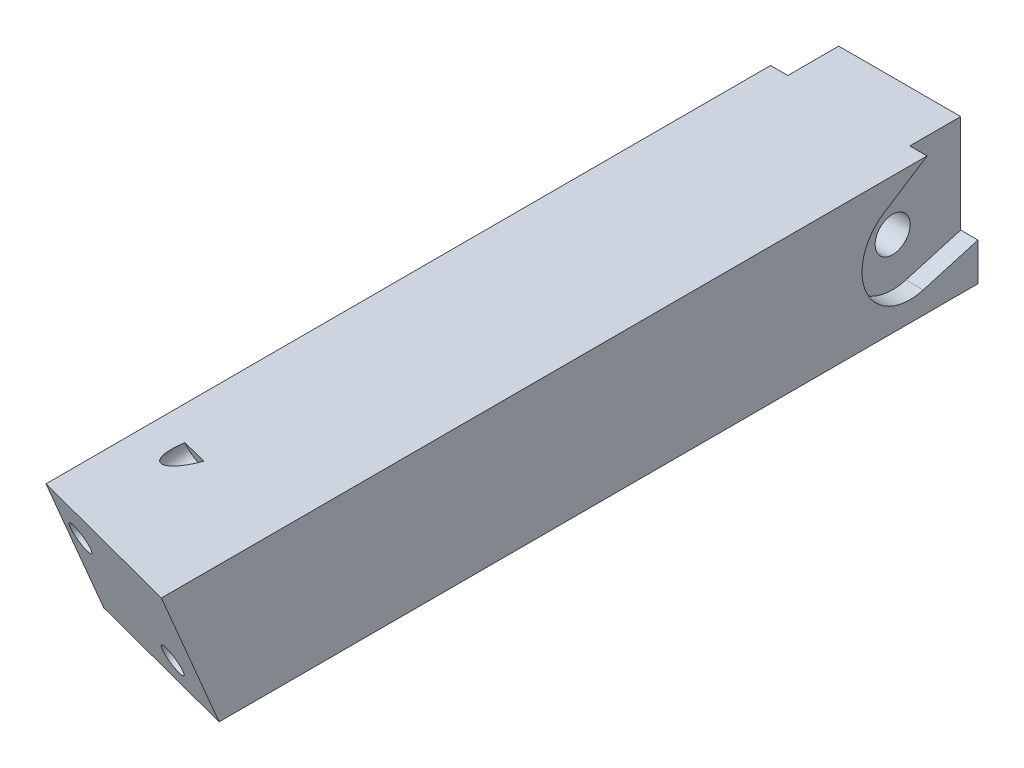
ISO-10303-21;
HEADER;
FILE_DESCRIPTION(('STEP AP214'),'2;1');
FILE_NAME('part.step','',(''),(''),'','','');
FILE_SCHEMA(('AUTOMOTIVE_DESIGN { 1 0 10303 214 1 1 1 1 }'));
ENDSEC;
DATA;
#1=APPLICATION_CONTEXT('core data for automotive mechanical design processes');
#2=APPLICATION_PROTOCOL_DEFINITION('international standard','automotive_design',2000,#1);
#3=PRODUCT_CONTEXT('',#1,'mechanical');
#4=PRODUCT('Part','Part','',(#3));
#5=PRODUCT_RELATED_PRODUCT_CATEGORY('part','',(#4));
#6=PRODUCT_DEFINITION_FORMATION('','',#4);
#7=PRODUCT_DEFINITION_CONTEXT('part definition',#1,'design');
#8=PRODUCT_DEFINITION('design','',#6,#7);
#9=PRODUCT_DEFINITION_SHAPE('','',#8);
#10=(LENGTH_UNIT() NAMED_UNIT(*) SI_UNIT(.MILLI.,.METRE.));
#11=(NAMED_UNIT(*) PLANE_ANGLE_UNIT() SI_UNIT($,.RADIAN.));
#12=(NAMED_UNIT(*) SI_UNIT($,.STERADIAN.) SOLID_ANGLE_UNIT());
#13=UNCERTAINTY_MEASURE_WITH_UNIT(LENGTH_MEASURE(1.E-05),#10,'distance_accuracy_value','');
#14=(GEOMETRIC_REPRESENTATION_CONTEXT(3) GLOBAL_UNCERTAINTY_ASSIGNED_CONTEXT((#13)) GLOBAL_UNIT_ASSIGNED_CONTEXT((#10,
#11,#12)) REPRESENTATION_CONTEXT('',''));
#15=CARTESIAN_POINT('',(0.,0.,0.));
#16=DIRECTION('',(0.,0.,1.));
#17=DIRECTION('',(1.,0.,0.));
#18=AXIS2_PLACEMENT_3D('',#15,#16,#17);
#19=CARTESIAN_POINT('',(14.605,-12.7,-12.7));
#20=DIRECTION('',(-1.,0.,0.));
#21=DIRECTION('',(0.,0.,-1.));
#22=AXIS2_PLACEMENT_3D('',#19,#20,#21);
#23=PLANE('',#22);
#24=DIRECTION('',(0.,0.,1.));
#25=VECTOR('',#24,1.);
#26=CARTESIAN_POINT('',(14.605,12.7,-12.7));
#27=LINE('',#26,#25);
#28=CARTESIAN_POINT('',(14.605,12.7,-3.20631944652385));
#29=VERTEX_POINT('',#28);
#30=CARTESIAN_POINT('',(14.605,12.7,139.643198338925));
#31=VERTEX_POINT('',#30);
#32=EDGE_CURVE('E217',#29,#31,#27,.T.);
#33=ORIENTED_EDGE('',*,*,#32,.T.);
#34=DIRECTION('',(0.,0.920719568766406,0.390224903985642));
#35=VECTOR('',#34,1.);
#36=CARTESIAN_POINT('',(14.605,2.578776447838,135.353560513423));
#37=LINE('',#36,#35);
#38=CARTESIAN_POINT('',(14.605,-12.7,128.878017606951));
#39=VERTEX_POINT('',#38);
#40=EDGE_CURVE('E193',#39,#31,#37,.T.);
#41=ORIENTED_EDGE('',*,*,#40,.F.);
#42=DIRECTION('',(0.,0.,1.));
#43=VECTOR('',#42,1.);
#44=CARTESIAN_POINT('',(14.605,-12.7,-12.7));
#45=LINE('',#44,#43);
#46=CARTESIAN_POINT('',(14.605,-12.7,-12.7));
#47=VERTEX_POINT('',#46);
#48=EDGE_CURVE('E210',#47,#39,#45,.T.);
#49=ORIENTED_EDGE('',*,*,#48,.F.);
#50=DIRECTION('',(0.,1.,0.));
#51=VECTOR('',#50,1.);
#52=CARTESIAN_POINT('',(14.605,-12.7,-12.7));
#53=LINE('',#52,#51);
#54=CARTESIAN_POINT('',(14.605,-5.63975041943291,-12.7));
#55=VERTEX_POINT('',#54);
#56=EDGE_CURVE('E196',#47,#55,#53,.T.);
#57=ORIENTED_EDGE('',*,*,#56,.T.);
#58=DIRECTION('',(0.,-0.277346198030361,0.960770048678717));
#59=VECTOR('',#58,1.);
#60=CARTESIAN_POINT('',(14.605,-6.18283126714513,-10.8186840987962));
#61=LINE('',#60,#59);
#62=CARTESIAN_POINT('',(14.605,-8.59005285122667,-2.47969688734968));
#63=VERTEX_POINT('',#62);
#64=EDGE_CURVE('E175',#55,#63,#61,.T.);
#65=ORIENTED_EDGE('',*,*,#64,.T.);
#66=CARTESIAN_POINT('',(14.605,0.,1.65999089474234E-13));
#67=DIRECTION('',(1.,0.,0.));
#68=DIRECTION('',(0.,0.,-1.));
#69=AXIS2_PLACEMENT_3D('',#66,#67,#68);
#70=CIRCLE('',#69,8.9408);
#71=CARTESIAN_POINT('',(14.605,7.51659919680162,4.84134703926943));
#72=VERTEX_POINT('',#71);
#73=EDGE_CURVE('E227',#63,#72,#70,.F.);
#74=ORIENTED_EDGE('',*,*,#73,.T.);
#75=DIRECTION('',(0.,-0.541489244728577,0.840707676807625));
#76=VECTOR('',#75,1.);
#77=CARTESIAN_POINT('',(14.605,9.57429844430268,1.64659558155112));
#78=LINE('',#77,#76);
#79=EDGE_CURVE('E186',#29,#72,#78,.T.);
#80=ORIENTED_EDGE('',*,*,#79,.F.);
#81=EDGE_LOOP('',(#33,#41,#49,#57,#65,#74,#80));
#82=FACE_BOUND('',#81,.T.);
#83=ADVANCED_FACE('F41',(#82),#23,.F.);
#84=CARTESIAN_POINT('',(-14.605,12.7,-12.7));
#85=DIRECTION('',(0.,-1.,0.));
#86=DIRECTION('',(0.,0.,1.));
#87=AXIS2_PLACEMENT_3D('',#84,#85,#86);
#88=PLANE('',#87);
#89=DIRECTION('',(0.967127916637602,0.,0.254290371151193));
#90=VECTOR('',#89,1.);
#91=CARTESIAN_POINT('',(-44.9467533679526,12.7,102.69704232227));
#92=LINE('',#91,#90);
#93=CARTESIAN_POINT('',(-8.30064374781228,12.7,112.332533818525));
#94=VERTEX_POINT('',#93);
#95=CARTESIAN_POINT('',(-3.54130283961957,12.7,113.583924193221));
#96=VERTEX_POINT('',#95);
#97=EDGE_CURVE('E11',#94,#96,#92,.T.);
#98=ORIENTED_EDGE('',*,*,#97,.T.);
#99=CARTESIAN_POINT('',(-5.5341151368064,12.7,111.486913668087));
#100=DIRECTION('',(0.,1.,0.));
#101=DIRECTION('',(-0.254290371151193,0.,0.967127916637602));
#102=AXIS2_PLACEMENT_3D('',#99,#100,#101);
#103=ELLIPSE('',#102,6.66360306804604,2.5273);
#104=EDGE_CURVE('E135',#94,#96,#103,.T.);
#105=ORIENTED_EDGE('',*,*,#104,.F.);
#106=EDGE_LOOP('',(#98,#105));
#107=FACE_BOUND('',#106,.T.);
#108=DIRECTION('',(-1.,0.,0.));
#109=VECTOR('',#108,1.);
#110=CARTESIAN_POINT('',(-14.6050000000001,12.7,-3.20631944652418));
#111=LINE('',#110,#109);
#112=CARTESIAN_POINT('',(-11.3792,12.7,-3.20631944652416));
#113=VERTEX_POINT('',#112);
#114=CARTESIAN_POINT('',(-14.605,12.7,-3.20631944652419));
#115=VERTEX_POINT('',#114);
#116=EDGE_CURVE('E150',#113,#115,#111,.T.);
#117=ORIENTED_EDGE('',*,*,#116,.T.);
#118=DIRECTION('',(0.,0.,1.));
#119=VECTOR('',#118,1.);
#120=CARTESIAN_POINT('',(-14.605,12.7,-12.7));
#121=LINE('',#120,#119);
#122=CARTESIAN_POINT('',(-14.605,12.7,131.962909502727));
#123=VERTEX_POINT('',#122);
#124=EDGE_CURVE('E152',#115,#123,#121,.T.);
#125=ORIENTED_EDGE('',*,*,#124,.T.);
#126=DIRECTION('',(-0.967127916637602,0.,-0.254290371151193));
#127=VECTOR('',#126,1.);
#128=CARTESIAN_POINT('',(-4.90539656623421,12.7,134.513260614261));
#129=LINE('',#128,#127);
#130=EDGE_CURVE('E189',#31,#123,#129,.T.);
#131=ORIENTED_EDGE('',*,*,#130,.F.);
#132=ORIENTED_EDGE('',*,*,#32,.F.);
#133=DIRECTION('',(1.,0.,0.));
#134=VECTOR('',#133,1.);
#135=CARTESIAN_POINT('',(-14.6050000000001,12.7,-3.20631944652418));
#136=LINE('',#135,#134);
#137=CARTESIAN_POINT('',(11.3792,12.7,-3.20631944652388));
#138=VERTEX_POINT('',#137);
#139=EDGE_CURVE('E225',#138,#29,#136,.T.);
#140=ORIENTED_EDGE('',*,*,#139,.F.);
#141=DIRECTION('',(0.,0.,-1.));
#142=VECTOR('',#141,1.);
#143=CARTESIAN_POINT('',(11.3792000000001,12.7,-12.6999999999997));
#144=LINE('',#143,#142);
#145=CARTESIAN_POINT('',(11.3792000000001,12.7,-12.7));
#146=VERTEX_POINT('',#145);
#147=EDGE_CURVE('E183',#138,#146,#144,.T.);
#148=ORIENTED_EDGE('',*,*,#147,.T.);
#149=DIRECTION('',(-1.,0.,0.));
#150=VECTOR('',#149,1.);
#151=CARTESIAN_POINT('',(-14.605,12.7,-12.7));
#152=LINE('',#151,#150);
#153=CARTESIAN_POINT('',(-11.3791999999999,12.7,-12.7));
#154=VERTEX_POINT('',#153);
#155=EDGE_CURVE('E203',#146,#154,#152,.T.);
#156=ORIENTED_EDGE('',*,*,#155,.T.);
#157=DIRECTION('',(0.,0.,-1.));
#158=VECTOR('',#157,1.);
#159=CARTESIAN_POINT('',(-11.3791999999999,12.7,-12.7));
#160=LINE('',#159,#158);
#161=EDGE_CURVE('E155',#113,#154,#160,.T.);
#162=ORIENTED_EDGE('',*,*,#161,.F.);
#163=EDGE_LOOP('',(#117,#125,#131,#132,#140,#148,#156,#162));
#164=FACE_BOUND('',#163,.T.);
#165=ADVANCED_FACE('F142',(#107,#164),#88,.F.);
#166=CARTESIAN_POINT('',(0.,0.,-12.7));
#167=DIRECTION('',(0.,0.,1.));
#168=DIRECTION('',(-1.,0.,0.));
#169=AXIS2_PLACEMENT_3D('',#166,#167,#168);
#170=PLANE('',#169);
#171=ORIENTED_EDGE('',*,*,#155,.F.);
#172=DIRECTION('',(0.,-1.,0.));
#173=VECTOR('',#172,1.);
#174=CARTESIAN_POINT('',(11.3792000000001,0.,-12.7));
#175=LINE('',#174,#173);
#176=CARTESIAN_POINT('',(11.3792,-5.63975041943293,-12.7));
#177=VERTEX_POINT('',#176);
#178=EDGE_CURVE('E222',#146,#177,#175,.T.);
#179=ORIENTED_EDGE('',*,*,#178,.T.);
#180=DIRECTION('',(1.,0.,0.));
#181=VECTOR('',#180,1.);
#182=CARTESIAN_POINT('',(0.,-5.63975041943296,-12.7));
#183=LINE('',#182,#181);
#184=EDGE_CURVE('E220',#177,#55,#183,.T.);
#185=ORIENTED_EDGE('',*,*,#184,.T.);
#186=ORIENTED_EDGE('',*,*,#56,.F.);
#187=DIRECTION('',(1.,0.,0.));
#188=VECTOR('',#187,1.);
#189=CARTESIAN_POINT('',(-14.605,-12.7,-12.7));
#190=LINE('',#189,#188);
#191=CARTESIAN_POINT('',(-14.605,-12.7,-12.7));
#192=VERTEX_POINT('',#191);
#193=EDGE_CURVE('E208',#192,#47,#190,.T.);
#194=ORIENTED_EDGE('',*,*,#193,.F.);
#195=DIRECTION('',(0.,-1.,0.));
#196=VECTOR('',#195,1.);
#197=CARTESIAN_POINT('',(-14.605,-12.7,-12.7));
#198=LINE('',#197,#196);
#199=CARTESIAN_POINT('',(-14.605,-5.63975041943301,-12.7));
#200=VERTEX_POINT('',#199);
#201=EDGE_CURVE('E205',#200,#192,#198,.T.);
#202=ORIENTED_EDGE('',*,*,#201,.F.);
#203=DIRECTION('',(-1.,0.,0.));
#204=VECTOR('',#203,1.);
#205=CARTESIAN_POINT('',(0.,-5.63975041943296,-12.7));
#206=LINE('',#205,#204);
#207=CARTESIAN_POINT('',(-11.3791999999999,-5.639750419433,-12.7));
#208=VERTEX_POINT('',#207);
#209=EDGE_CURVE('E156',#208,#200,#206,.T.);
#210=ORIENTED_EDGE('',*,*,#209,.F.);
#211=DIRECTION('',(0.,-1.,0.));
#212=VECTOR('',#211,1.);
#213=CARTESIAN_POINT('',(-11.3791999999999,0.,-12.7));
#214=LINE('',#213,#212);
#215=EDGE_CURVE('E48',#154,#208,#214,.T.);
#216=ORIENTED_EDGE('',*,*,#215,.F.);
#217=EDGE_LOOP('',(#171,#179,#185,#186,#194,#202,#210,#216));
#218=FACE_BOUND('',#217,.T.);
#219=ADVANCED_FACE('F145',(#218),#170,.F.);
#220=CARTESIAN_POINT('',(-14.605,-12.7,-12.7));
#221=DIRECTION('',(1.,0.,0.));
#222=DIRECTION('',(0.,0.,1.));
#223=AXIS2_PLACEMENT_3D('',#220,#221,#222);
#224=PLANE('',#223);
#225=ORIENTED_EDGE('',*,*,#201,.T.);
#226=DIRECTION('',(0.,0.,1.));
#227=VECTOR('',#226,1.);
#228=CARTESIAN_POINT('',(-14.605,-12.7,-12.7));
#229=LINE('',#228,#227);
#230=CARTESIAN_POINT('',(-14.605,-12.7,121.197728770754));
#231=VERTEX_POINT('',#230);
#232=EDGE_CURVE('E213',#192,#231,#229,.T.);
#233=ORIENTED_EDGE('',*,*,#232,.T.);
#234=DIRECTION('',(0.,-0.920719568766406,-0.390224903985642));
#235=VECTOR('',#234,1.);
#236=CARTESIAN_POINT('',(-14.605,5.33820979998679,128.842791313199));
#237=LINE('',#236,#235);
#238=EDGE_CURVE('E192',#123,#231,#237,.T.);
#239=ORIENTED_EDGE('',*,*,#238,.F.);
#240=ORIENTED_EDGE('',*,*,#124,.F.);
#241=DIRECTION('',(0.,-0.541489244728577,0.840707676807625));
#242=VECTOR('',#241,1.);
#243=CARTESIAN_POINT('',(-14.605,9.57429844430252,1.64659558155102));
#244=LINE('',#243,#242);
#245=CARTESIAN_POINT('',(-14.605,7.51659919680161,4.84134703926911));
#246=VERTEX_POINT('',#245);
#247=EDGE_CURVE('E232',#115,#246,#244,.T.);
#248=ORIENTED_EDGE('',*,*,#247,.T.);
#249=CARTESIAN_POINT('',(-14.605,0.,-1.65999089474233E-13));
#250=DIRECTION('',(-1.,0.,0.));
#251=DIRECTION('',(0.,0.,1.));
#252=AXIS2_PLACEMENT_3D('',#249,#250,#251);
#253=CIRCLE('',#252,8.9408);
#254=CARTESIAN_POINT('',(-14.605,-8.59005285122667,-2.47969688735001));
#255=VERTEX_POINT('',#254);
#256=EDGE_CURVE('E230',#255,#246,#253,.T.);
#257=ORIENTED_EDGE('',*,*,#256,.F.);
#258=DIRECTION('',(0.,-0.277346198030361,0.960770048678717));
#259=VECTOR('',#258,1.);
#260=CARTESIAN_POINT('',(-14.605,-6.18283126714522,-10.8186840987962));
#261=LINE('',#260,#259);
#262=EDGE_CURVE('E235',#200,#255,#261,.T.);
#263=ORIENTED_EDGE('',*,*,#262,.F.);
#264=EDGE_LOOP('',(#225,#233,#239,#240,#248,#257,#263));
#265=FACE_BOUND('',#264,.T.);
#266=ADVANCED_FACE('F305',(#265),#224,.F.);
#267=CARTESIAN_POINT('',(-14.605,-12.7,-12.7));
#268=DIRECTION('',(0.,1.,0.));
#269=DIRECTION('',(0.,0.,-1.));
#270=AXIS2_PLACEMENT_3D('',#267,#268,#269);
#271=PLANE('',#270);
#272=ORIENTED_EDGE('',*,*,#232,.F.);
#273=ORIENTED_EDGE('',*,*,#193,.T.);
#274=ORIENTED_EDGE('',*,*,#48,.T.);
#275=DIRECTION('',(0.967127916637602,0.,0.254290371151193));
#276=VECTOR('',#275,1.);
#277=CARTESIAN_POINT('',(-2.2579014924499,-12.7,124.444195146206));
#278=LINE('',#277,#276);
#279=EDGE_CURVE('E197',#231,#39,#278,.T.);
#280=ORIENTED_EDGE('',*,*,#279,.F.);
#281=EDGE_LOOP('',(#272,#273,#274,#280));
#282=FACE_BOUND('',#281,.T.);
#283=ADVANCED_FACE('F284',(#282),#271,.F.);
#284=CARTESIAN_POINT('',(-280.001206524609,681.736801445705,345.7365443658));
#285=DIRECTION('',(-0.235291406157399,-0.379269289330745,0.894870247778428));
#286=DIRECTION('',(0.,0.920719568766406,0.390224903985642));
#287=AXIS2_PLACEMENT_3D('',#284,#285,#286);
#288=PLANE('',#287);
#289=CARTESIAN_POINT('',(-10.3476268944492,4.94103755712553,129.793865586104));
#290=DIRECTION('',(0.235291406157399,0.379269289330745,-0.894870247778428));
#291=DIRECTION('',(0.,0.920719568766406,0.390224903985642));
#292=AXIS2_PLACEMENT_3D('',#289,#290,#291);
#293=CIRCLE('',#292,2.5273);
#294=CARTESIAN_POINT('',(-10.3476268944492,7.26797212326886,130.780080985947));
#295=VERTEX_POINT('',#294);
#296=EDGE_CURVE('E136',#295,#295,#293,.T.);
#297=ORIENTED_EDGE('',*,*,#296,.T.);
#298=EDGE_LOOP('',(#297));
#299=FACE_BOUND('',#298,.T.);
#300=CARTESIAN_POINT('',(6.25664835183115,-6.77409955029027,129.194506678428));
#301=DIRECTION('',(0.235291406157399,0.379269289330745,-0.894870247778428));
#302=DIRECTION('',(0.,0.920719568766406,0.390224903985642));
#303=AXIS2_PLACEMENT_3D('',#300,#301,#302);
#304=CIRCLE('',#303,2.52729999999999);
#305=CARTESIAN_POINT('',(6.25664835183115,-4.44716498414694,130.180722078271));
#306=VERTEX_POINT('',#305);
#307=EDGE_CURVE('E417',#306,#306,#304,.T.);
#308=ORIENTED_EDGE('',*,*,#307,.T.);
#309=EDGE_LOOP('',(#308));
#310=FACE_BOUND('',#309,.T.);
#311=ORIENTED_EDGE('',*,*,#40,.T.);
#312=ORIENTED_EDGE('',*,*,#130,.T.);
#313=ORIENTED_EDGE('',*,*,#238,.T.);
#314=ORIENTED_EDGE('',*,*,#279,.T.);
#315=EDGE_LOOP('',(#311,#312,#313,#314));
#316=FACE_BOUND('',#315,.T.);
#317=ADVANCED_FACE('F282',(#299,#310,#316),#288,.T.);
#318=CARTESIAN_POINT('',(14.605,0.,1.65999089474234E-13));
#319=DIRECTION('',(-1.,0.,0.));
#320=DIRECTION('',(0.,0.413795376804024,-0.91036991719609));
#321=AXIS2_PLACEMENT_3D('',#318,#319,#320);
#322=CYLINDRICAL_SURFACE('',#321,8.9408);
#323=ORIENTED_EDGE('',*,*,#73,.F.);
#324=DIRECTION('',(-1.,0.,0.));
#325=VECTOR('',#324,1.);
#326=CARTESIAN_POINT('',(14.605,-8.59005285122667,-2.47969688734968));
#327=LINE('',#326,#325);
#328=CARTESIAN_POINT('',(11.3792,-8.59005285122667,-2.47969688734972));
#329=VERTEX_POINT('',#328);
#330=EDGE_CURVE('E176',#63,#329,#327,.T.);
#331=ORIENTED_EDGE('',*,*,#330,.T.);
#332=CARTESIAN_POINT('',(11.3792,0.,1.29334942755577E-13));
#333=DIRECTION('',(-1.,0.,0.));
#334=DIRECTION('',(0.,0.,1.));
#335=AXIS2_PLACEMENT_3D('',#332,#333,#334);
#336=CIRCLE('',#335,8.9408);
#337=CARTESIAN_POINT('',(11.3791999999999,7.51659919680162,4.8413470392694));
#338=VERTEX_POINT('',#337);
#339=EDGE_CURVE('E169',#338,#329,#336,.F.);
#340=ORIENTED_EDGE('',*,*,#339,.F.);
#341=DIRECTION('',(-1.,0.,0.));
#342=VECTOR('',#341,1.);
#343=CARTESIAN_POINT('',(14.6049999999999,7.51659919680162,4.84134703926943));
#344=LINE('',#343,#342);
#345=EDGE_CURVE('E172',#72,#338,#344,.T.);
#346=ORIENTED_EDGE('',*,*,#345,.F.);
#347=EDGE_LOOP('',(#323,#331,#340,#346));
#348=FACE_BOUND('',#347,.T.);
#349=ADVANCED_FACE('F297',(#348),#322,.F.);
#350=CARTESIAN_POINT('',(14.6049999999999,7.51659919680162,4.84134703926943));
#351=DIRECTION('',(0.,0.840707676807625,0.541489244728577));
#352=DIRECTION('',(0.,-0.541489244728578,0.840707676807625));
#353=AXIS2_PLACEMENT_3D('',#350,#351,#352);
#354=PLANE('',#353);
#355=ORIENTED_EDGE('',*,*,#139,.T.);
#356=ORIENTED_EDGE('',*,*,#79,.T.);
#357=ORIENTED_EDGE('',*,*,#345,.T.);
#358=DIRECTION('',(0.,0.541489244728577,-0.840707676807625));
#359=VECTOR('',#358,1.);
#360=CARTESIAN_POINT('',(11.3791999999999,7.51659919680162,4.8413470392694));
#361=LINE('',#360,#359);
#362=EDGE_CURVE('E167',#338,#138,#361,.T.);
#363=ORIENTED_EDGE('',*,*,#362,.T.);
#364=EDGE_LOOP('',(#355,#356,#357,#363));
#365=FACE_BOUND('',#364,.T.);
#366=ADVANCED_FACE('F299',(#365),#354,.F.);
#367=CARTESIAN_POINT('',(11.3792,0.,1.29334942755577E-13));
#368=DIRECTION('',(1.,0.,0.));
#369=DIRECTION('',(0.,-0.413795376804024,0.91036991719609));
#370=AXIS2_PLACEMENT_3D('',#367,#368,#369);
#371=PLANE('',#370);
#372=CARTESIAN_POINT('',(11.3792,0.,1.65999089474234E-13));
#373=DIRECTION('',(-1.,0.,0.));
#374=DIRECTION('',(0.,0.,1.));
#375=AXIS2_PLACEMENT_3D('',#372,#373,#374);
#376=CIRCLE('',#375,3.26389999999984);
#377=CARTESIAN_POINT('',(11.3792,0.,3.26390000000001));
#378=VERTEX_POINT('',#377);
#379=EDGE_CURVE('E240',#378,#378,#376,.T.);
#380=ORIENTED_EDGE('',*,*,#379,.T.);
#381=EDGE_LOOP('',(#380));
#382=FACE_BOUND('',#381,.T.);
#383=ORIENTED_EDGE('',*,*,#147,.F.);
#384=ORIENTED_EDGE('',*,*,#362,.F.);
#385=ORIENTED_EDGE('',*,*,#339,.T.);
#386=DIRECTION('',(0.,0.277346198030361,-0.960770048678717));
#387=VECTOR('',#386,1.);
#388=CARTESIAN_POINT('',(11.3792,-8.59005285122667,-2.47969688734972));
#389=LINE('',#388,#387);
#390=EDGE_CURVE('E173',#329,#177,#389,.T.);
#391=ORIENTED_EDGE('',*,*,#390,.T.);
#392=ORIENTED_EDGE('',*,*,#178,.F.);
#393=EDGE_LOOP('',(#383,#384,#385,#391,#392));
#394=FACE_BOUND('',#393,.T.);
#395=ADVANCED_FACE('F302',(#382,#394),#371,.T.);
#396=CARTESIAN_POINT('',(14.605,-8.59005285122667,-2.47969688734968));
#397=DIRECTION('',(0.,0.960770048678717,0.277346198030361));
#398=DIRECTION('',(0.,-0.277346198030361,0.960770048678717));
#399=AXIS2_PLACEMENT_3D('',#396,#397,#398);
#400=PLANE('',#399);
#401=ORIENTED_EDGE('',*,*,#64,.F.);
#402=ORIENTED_EDGE('',*,*,#184,.F.);
#403=ORIENTED_EDGE('',*,*,#390,.F.);
#404=ORIENTED_EDGE('',*,*,#330,.F.);
#405=EDGE_LOOP('',(#401,#402,#403,#404));
#406=FACE_BOUND('',#405,.T.);
#407=ADVANCED_FACE('F293',(#406),#400,.T.);
#408=CARTESIAN_POINT('',(-11.3792,0.,-1.29334942755577E-13));
#409=DIRECTION('',(1.,0.,0.));
#410=DIRECTION('',(0.,-0.413795376804024,0.91036991719609));
#411=AXIS2_PLACEMENT_3D('',#408,#409,#410);
#412=PLANE('',#411);
#413=CARTESIAN_POINT('',(-11.3792,0.,1.65999089474234E-13));
#414=DIRECTION('',(-1.,0.,0.));
#415=DIRECTION('',(0.,0.,1.));
#416=AXIS2_PLACEMENT_3D('',#413,#414,#415);
#417=CIRCLE('',#416,3.26389999999984);
#418=CARTESIAN_POINT('',(-11.3792,0.,3.26390000000001));
#419=VERTEX_POINT('',#418);
#420=EDGE_CURVE('E140',#419,#419,#417,.T.);
#421=ORIENTED_EDGE('',*,*,#420,.F.);
#422=EDGE_LOOP('',(#421));
#423=FACE_BOUND('',#422,.T.);
#424=DIRECTION('',(0.,0.541489244728577,-0.840707676807625));
#425=VECTOR('',#424,1.);
#426=CARTESIAN_POINT('',(-11.3792000000001,7.51659919680162,4.84134703926914));
#427=LINE('',#426,#425);
#428=CARTESIAN_POINT('',(-11.3792000000001,7.51659919680161,4.84134703926914));
#429=VERTEX_POINT('',#428);
#430=EDGE_CURVE('E248',#429,#113,#427,.T.);
#431=ORIENTED_EDGE('',*,*,#430,.T.);
#432=ORIENTED_EDGE('',*,*,#161,.T.);
#433=ORIENTED_EDGE('',*,*,#215,.T.);
#434=DIRECTION('',(0.,0.277346198030361,-0.960770048678717));
#435=VECTOR('',#434,1.);
#436=CARTESIAN_POINT('',(-11.3792,-8.59005285122667,-2.47969688734998));
#437=LINE('',#436,#435);
#438=CARTESIAN_POINT('',(-11.3792,-8.59005285122667,-2.47969688734998));
#439=VERTEX_POINT('',#438);
#440=EDGE_CURVE('E157',#439,#208,#437,.T.);
#441=ORIENTED_EDGE('',*,*,#440,.F.);
#442=CARTESIAN_POINT('',(-11.3792,0.,-1.29334942755577E-13));
#443=DIRECTION('',(-1.,0.,0.));
#444=DIRECTION('',(0.,0.,1.));
#445=AXIS2_PLACEMENT_3D('',#442,#443,#444);
#446=CIRCLE('',#445,8.9408);
#447=EDGE_CURVE('E161',#429,#439,#446,.F.);
#448=ORIENTED_EDGE('',*,*,#447,.F.);
#449=EDGE_LOOP('',(#431,#432,#433,#441,#448));
#450=FACE_BOUND('',#449,.T.);
#451=ADVANCED_FACE('F259',(#423,#450),#412,.F.);
#452=CARTESIAN_POINT('',(-14.605,-8.59005285122667,-2.47969688735001));
#453=DIRECTION('',(0.,-0.960770048678717,-0.277346198030361));
#454=DIRECTION('',(0.,0.277346198030361,-0.960770048678717));
#455=AXIS2_PLACEMENT_3D('',#452,#453,#454);
#456=PLANE('',#455);
#457=ORIENTED_EDGE('',*,*,#440,.T.);
#458=ORIENTED_EDGE('',*,*,#209,.T.);
#459=ORIENTED_EDGE('',*,*,#262,.T.);
#460=DIRECTION('',(-1.,0.,0.));
#461=VECTOR('',#460,1.);
#462=CARTESIAN_POINT('',(-14.605,-8.59005285122667,-2.47969688735001));
#463=LINE('',#462,#461);
#464=EDGE_CURVE('E244',#255,#439,#463,.F.);
#465=ORIENTED_EDGE('',*,*,#464,.T.);
#466=EDGE_LOOP('',(#457,#458,#459,#465));
#467=FACE_BOUND('',#466,.T.);
#468=ADVANCED_FACE('F262',(#467),#456,.F.);
#469=CARTESIAN_POINT('',(-14.6050000000001,7.51659919680162,4.8413470392691));
#470=DIRECTION('',(0.,-0.840707676807625,-0.541489244728577));
#471=DIRECTION('',(0.,0.541489244728578,-0.840707676807625));
#472=AXIS2_PLACEMENT_3D('',#469,#470,#471);
#473=PLANE('',#472);
#474=ORIENTED_EDGE('',*,*,#116,.F.);
#475=ORIENTED_EDGE('',*,*,#430,.F.);
#476=DIRECTION('',(1.,0.,0.));
#477=VECTOR('',#476,1.);
#478=CARTESIAN_POINT('',(-14.6050000000001,7.51659919680161,4.8413470392691));
#479=LINE('',#478,#477);
#480=EDGE_CURVE('E62',#246,#429,#479,.T.);
#481=ORIENTED_EDGE('',*,*,#480,.F.);
#482=ORIENTED_EDGE('',*,*,#247,.F.);
#483=EDGE_LOOP('',(#474,#475,#481,#482));
#484=FACE_BOUND('',#483,.T.);
#485=ADVANCED_FACE('F260',(#484),#473,.T.);
#486=CARTESIAN_POINT('',(-14.605,0.,-1.65999089474234E-13));
#487=DIRECTION('',(1.,0.,0.));
#488=DIRECTION('',(0.,-0.413795376804024,0.91036991719609));
#489=AXIS2_PLACEMENT_3D('',#486,#487,#488);
#490=CYLINDRICAL_SURFACE('',#489,8.9408);
#491=ORIENTED_EDGE('',*,*,#464,.F.);
#492=ORIENTED_EDGE('',*,*,#256,.T.);
#493=ORIENTED_EDGE('',*,*,#480,.T.);
#494=ORIENTED_EDGE('',*,*,#447,.T.);
#495=EDGE_LOOP('',(#491,#492,#493,#494));
#496=FACE_BOUND('',#495,.T.);
#497=ADVANCED_FACE('F256',(#496),#490,.F.);
#498=CARTESIAN_POINT('',(-14.605,0.,1.65999089474234E-13));
#499=DIRECTION('',(1.,0.,0.));
#500=DIRECTION('',(0.,0.,1.));
#501=AXIS2_PLACEMENT_3D('',#498,#499,#500);
#502=CYLINDRICAL_SURFACE('',#501,3.26389999999984);
#503=CARTESIAN_POINT('',(11.3792,0.,3.26390000000001));
#504=CARTESIAN_POINT('',(11.1421333333333,0.,3.26390000000001));
#505=CARTESIAN_POINT('',(10.9050666666666,0.,3.26390000000001));
#506=CARTESIAN_POINT('',(10.4309333333333,0.,3.26390000000001));
#507=CARTESIAN_POINT('',(10.1938666666666,0.,3.26390000000001));
#508=CARTESIAN_POINT('',(9.7197333333333,0.,3.26390000000001));
#509=CARTESIAN_POINT('',(9.48266666666663,0.,3.26390000000001));
#510=CARTESIAN_POINT('',(9.0085333333333,0.,3.26390000000001));
#511=CARTESIAN_POINT('',(8.77146666666663,0.,3.26390000000001));
#512=CARTESIAN_POINT('',(8.2973333333333,0.,3.26390000000001));
#513=CARTESIAN_POINT('',(8.06026666666663,0.,3.26390000000001));
#514=CARTESIAN_POINT('',(7.5861333333333,0.,3.26390000000001));
#515=CARTESIAN_POINT('',(7.34906666666663,0.,3.26390000000001));
#516=CARTESIAN_POINT('',(6.8749333333333,0.,3.26390000000001));
#517=CARTESIAN_POINT('',(6.63786666666663,0.,3.26390000000001));
#518=CARTESIAN_POINT('',(6.16373333333329,0.,3.26390000000001));
#519=CARTESIAN_POINT('',(5.92666666666663,0.,3.26390000000001));
#520=CARTESIAN_POINT('',(5.4525333333333,0.,3.26390000000001));
#521=CARTESIAN_POINT('',(5.21546666666663,0.,3.26390000000001));
#522=CARTESIAN_POINT('',(4.74133333333329,0.,3.26390000000001));
#523=CARTESIAN_POINT('',(4.50426666666663,0.,3.26390000000001));
#524=CARTESIAN_POINT('',(4.0301333333333,0.,3.26390000000001));
#525=CARTESIAN_POINT('',(3.79306666666663,0.,3.26390000000001));
#526=CARTESIAN_POINT('',(3.31893333333329,0.,3.26390000000001));
#527=CARTESIAN_POINT('',(3.08186666666663,0.,3.26390000000001));
#528=CARTESIAN_POINT('',(2.6077333333333,0.,3.26390000000001));
#529=CARTESIAN_POINT('',(2.37066666666663,0.,3.26390000000001));
#530=CARTESIAN_POINT('',(1.8965333333333,0.,3.26390000000001));
#531=CARTESIAN_POINT('',(1.65946666666663,0.,3.26390000000001));
#532=CARTESIAN_POINT('',(1.1853333333333,0.,3.26390000000001));
#533=CARTESIAN_POINT('',(0.94826666666663,0.,3.26390000000001));
#534=CARTESIAN_POINT('',(0.474133333333297,0.,3.26390000000001));
#535=CARTESIAN_POINT('',(0.23706666666663,0.,3.26390000000001));
#536=CARTESIAN_POINT('',(-0.237066666666703,0.,3.26390000000001));
#537=CARTESIAN_POINT('',(-0.47413333333337,0.,3.26390000000001));
#538=CARTESIAN_POINT('',(-0.948266666666704,0.,3.26390000000001));
#539=CARTESIAN_POINT('',(-1.18533333333337,0.,3.26390000000001));
#540=CARTESIAN_POINT('',(-1.6594666666667,0.,3.26390000000001));
#541=CARTESIAN_POINT('',(-1.89653333333337,0.,3.26390000000001));
#542=CARTESIAN_POINT('',(-2.3706666666667,0.,3.26390000000001));
#543=CARTESIAN_POINT('',(-2.60773333333337,0.,3.26390000000001));
#544=CARTESIAN_POINT('',(-3.0818666666667,0.,3.26390000000001));
#545=CARTESIAN_POINT('',(-3.31893333333337,0.,3.26390000000001));
#546=CARTESIAN_POINT('',(-3.7930666666667,0.,3.26390000000001));
#547=CARTESIAN_POINT('',(-4.03013333333337,0.,3.26390000000001));
#548=CARTESIAN_POINT('',(-4.5042666666667,0.,3.26390000000001));
#549=CARTESIAN_POINT('',(-4.74133333333337,0.,3.26390000000001));
#550=CARTESIAN_POINT('',(-5.2154666666667,0.,3.26390000000001));
#551=CARTESIAN_POINT('',(-5.45253333333337,0.,3.26390000000001));
#552=CARTESIAN_POINT('',(-5.9266666666667,0.,3.26390000000001));
#553=CARTESIAN_POINT('',(-6.16373333333337,0.,3.26390000000001));
#554=CARTESIAN_POINT('',(-6.6378666666667,0.,3.26390000000001));
#555=CARTESIAN_POINT('',(-6.87493333333337,0.,3.26390000000001));
#556=CARTESIAN_POINT('',(-7.3490666666667,0.,3.26390000000001));
#557=CARTESIAN_POINT('',(-7.58613333333337,0.,3.26390000000001));
#558=CARTESIAN_POINT('',(-8.0602666666667,0.,3.26390000000001));
#559=CARTESIAN_POINT('',(-8.29733333333337,0.,3.26390000000001));
#560=CARTESIAN_POINT('',(-8.7714666666667,0.,3.26390000000001));
#561=CARTESIAN_POINT('',(-9.00853333333337,0.,3.26390000000001));
#562=CARTESIAN_POINT('',(-9.4826666666667,0.,3.26390000000001));
#563=CARTESIAN_POINT('',(-9.71973333333337,0.,3.26390000000001));
#564=CARTESIAN_POINT('',(-10.1938666666667,0.,3.26390000000001));
#565=CARTESIAN_POINT('',(-10.4309333333334,0.,3.26390000000001));
#566=CARTESIAN_POINT('',(-10.9050666666667,0.,3.26390000000001));
#567=CARTESIAN_POINT('',(-11.1421333333334,0.,3.26390000000001));
#568=CARTESIAN_POINT('',(-11.3792,0.,3.26390000000001));
#569=B_SPLINE_CURVE_WITH_KNOTS('',3,(#503,#504,#505,#506,#507,#508,#509,#510,#511,#512,#513,
#514,#515,#516,#517,#518,#519,#520,#521,#522,#523,#524,#525,#526,#527,#528,#529,#530,#531,#532,
#533,#534,#535,#536,#537,#538,#539,#540,#541,#542,#543,#544,#545,#546,#547,#548,#549,#550,#551,
#552,#553,#554,#555,#556,#557,#558,#559,#560,#561,#562,#563,#564,#565,#566,#567,#568),
.UNSPECIFIED.,.F.,.F.,(4,2,2,2,2,2,2,2,2,2,2,2,2,2,2,2,2,2,2,2,2,2,2,2,2,2,2,2,2,2,2,2,4),(0.,
0.711199999999999,1.4224,2.1336,2.8448,3.556,4.2672,4.9784,5.6896,6.4008,7.112,7.8232,8.5344,
9.2456,9.9568,10.668,11.3792,12.0904,12.8016,13.5128,14.224,14.9352,15.6464,16.3576,17.0688,
17.78,18.4912,19.2024,19.9136,20.6248,21.336,22.0472,22.7584),.UNSPECIFIED.);
#570=EDGE_CURVE('BSEAM268',#378,#419,#569,.T.);
#571=ORIENTED_EDGE('',*,*,#379,.F.);
#572=ORIENTED_EDGE('',*,*,#420,.T.);
#573=ORIENTED_EDGE('',*,*,#570,.T.);
#574=ORIENTED_EDGE('',*,*,#570,.F.);
#575=EDGE_LOOP('',(#571,#573,#572,#574));
#576=FACE_BOUND('',#575,.T.);
#577=ADVANCED_FACE('F268',(#576),#502,.F.);
#578=CARTESIAN_POINT('',(10.7389496391296,0.450980411460431,112.147228458249));
#579=DIRECTION('',(-0.235291406157399,-0.379269289330745,0.894870247778428));
#580=DIRECTION('',(0.,0.920719568766406,0.390224903985642));
#581=AXIS2_PLACEMENT_3D('',#578,#579,#580);
#582=CYLINDRICAL_SURFACE('',#581,2.52729999999999);
#583=CARTESIAN_POINT('',(10.7389496391296,0.450980411460431,112.147228458249));
#584=DIRECTION('',(0.235291406157399,0.379269289330745,-0.894870247778428));
#585=DIRECTION('',(0.,0.920719568766406,0.390224903985642));
#586=AXIS2_PLACEMENT_3D('',#583,#584,#585);
#587=CIRCLE('',#586,2.52729999999999);
#588=CARTESIAN_POINT('',(10.7389496391296,2.77791497760376,113.133443858092));
#589=VERTEX_POINT('',#588);
#590=EDGE_CURVE('E420',#589,#589,#587,.T.);
#591=ORIENTED_EDGE('',*,*,#590,.T.);
#592=EDGE_LOOP('',(#591));
#593=FACE_BOUND('',#592,.T.);
#594=ORIENTED_EDGE('',*,*,#307,.F.);
#595=EDGE_LOOP('',(#594));
#596=FACE_BOUND('',#595,.T.);
#597=ADVANCED_FACE('F375',(#593,#596),#582,.F.);
#598=CARTESIAN_POINT('',(10.7389496391296,0.450980411460431,112.147228458249));
#599=DIRECTION('',(-0.235291406157399,-0.379269289330745,0.894870247778428));
#600=DIRECTION('',(0.,0.920719568766406,0.390224903985642));
#601=AXIS2_PLACEMENT_3D('',#598,#599,#600);
#602=PLANE('',#601);
#603=ORIENTED_EDGE('',*,*,#590,.F.);
#604=EDGE_LOOP('',(#603));
#605=FACE_BOUND('',#604,.T.);
#606=ADVANCED_FACE('F385',(#605),#602,.T.);
#607=CARTESIAN_POINT('',(-5.86532560715077,12.1661175188762,112.746587365925));
#608=DIRECTION('',(-0.235291406157399,-0.379269289330745,0.894870247778428));
#609=DIRECTION('',(0.,0.920719568766406,0.390224903985642));
#610=AXIS2_PLACEMENT_3D('',#607,#608,#609);
#611=PLANE('',#610);
#612=ORIENTED_EDGE('',*,*,#97,.F.);
#613=CARTESIAN_POINT('',(-5.86532560715077,12.1661175188762,112.746587365925));
#614=DIRECTION('',(0.235291406157399,0.379269289330745,-0.894870247778428));
#615=DIRECTION('',(0.,0.920719568766406,0.390224903985642));
#616=AXIS2_PLACEMENT_3D('',#613,#614,#615);
#617=CIRCLE('',#616,2.5273);
#618=EDGE_CURVE('E54',#96,#94,#617,.T.);
#619=ORIENTED_EDGE('',*,*,#618,.F.);
#620=EDGE_LOOP('',(#612,#619));
#621=FACE_BOUND('',#620,.T.);
#622=ADVANCED_FACE('F134',(#621),#611,.T.);
#623=CARTESIAN_POINT('',(-5.86532560715077,12.1661175188762,112.746587365925));
#624=DIRECTION('',(-0.235291406157399,-0.379269289330745,0.894870247778428));
#625=DIRECTION('',(0.,0.920719568766406,0.390224903985642));
#626=AXIS2_PLACEMENT_3D('',#623,#624,#625);
#627=CYLINDRICAL_SURFACE('',#626,2.5273);
#628=ORIENTED_EDGE('',*,*,#296,.F.);
#629=EDGE_LOOP('',(#628));
#630=FACE_BOUND('',#629,.T.);
#631=ORIENTED_EDGE('',*,*,#618,.T.);
#632=ORIENTED_EDGE('',*,*,#104,.T.);
#633=EDGE_LOOP('',(#631,#632));
#634=FACE_BOUND('',#633,.T.);
#635=ADVANCED_FACE('F138',(#630,#634),#627,.F.);
#636=CLOSED_SHELL('',(#83,#165,#219,#266,#283,#317,#349,#366,#395,#407,#451,#468,#485,#497,#577,
#597,#606,#622,#635));
#637=MANIFOLD_SOLID_BREP('B2',#636);
#638=ADVANCED_BREP_SHAPE_REPRESENTATION('',(#18,#637),#14);
#639=SHAPE_DEFINITION_REPRESENTATION(#9,#638);
ENDSEC;
END-ISO-10303-21;
